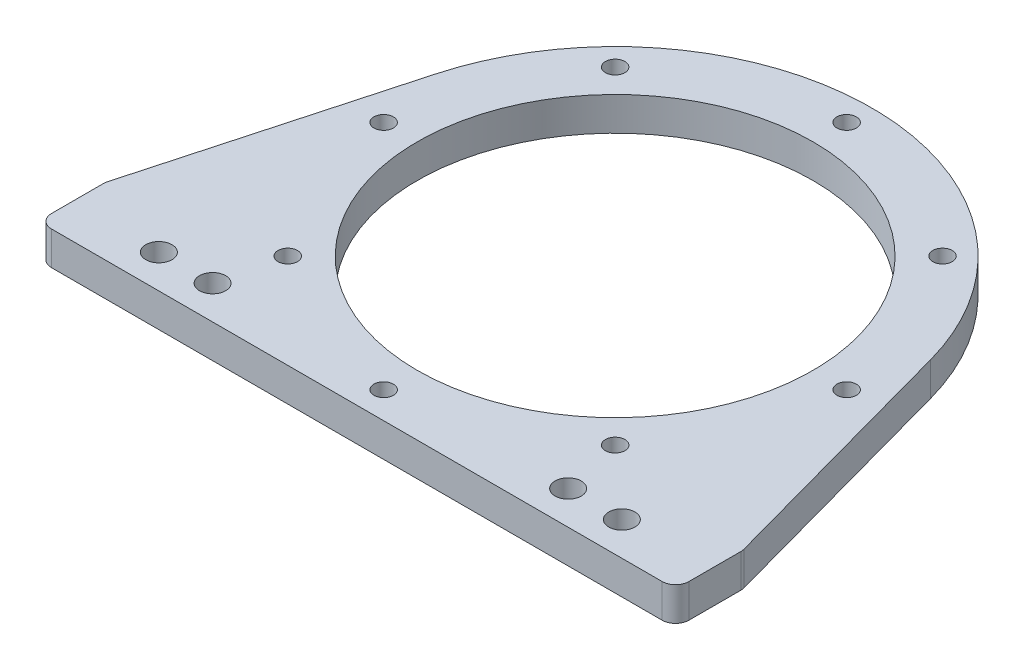
ISO-10303-21;
HEADER;
FILE_DESCRIPTION(('STEP AP214'),'2;1');
FILE_NAME('part.step','',(''),(''),'','','');
FILE_SCHEMA(('AUTOMOTIVE_DESIGN { 1 0 10303 214 1 1 1 1 }'));
ENDSEC;
DATA;
#1=APPLICATION_CONTEXT('core data for automotive mechanical design processes');
#2=APPLICATION_PROTOCOL_DEFINITION('international standard','automotive_design',2000,#1);
#3=PRODUCT_CONTEXT('',#1,'mechanical');
#4=PRODUCT('Part','Part','',(#3));
#5=PRODUCT_RELATED_PRODUCT_CATEGORY('part','',(#4));
#6=PRODUCT_DEFINITION_FORMATION('','',#4);
#7=PRODUCT_DEFINITION_CONTEXT('part definition',#1,'design');
#8=PRODUCT_DEFINITION('design','',#6,#7);
#9=PRODUCT_DEFINITION_SHAPE('','',#8);
#10=(LENGTH_UNIT() NAMED_UNIT(*) SI_UNIT(.MILLI.,.METRE.));
#11=(NAMED_UNIT(*) PLANE_ANGLE_UNIT() SI_UNIT($,.RADIAN.));
#12=(NAMED_UNIT(*) SI_UNIT($,.STERADIAN.) SOLID_ANGLE_UNIT());
#13=UNCERTAINTY_MEASURE_WITH_UNIT(LENGTH_MEASURE(1.E-05),#10,'distance_accuracy_value','');
#14=(GEOMETRIC_REPRESENTATION_CONTEXT(3) GLOBAL_UNCERTAINTY_ASSIGNED_CONTEXT((#13)) GLOBAL_UNIT_ASSIGNED_CONTEXT((#10,
#11,#12)) REPRESENTATION_CONTEXT('',''));
#15=CARTESIAN_POINT('',(0.,0.,0.));
#16=DIRECTION('',(0.,0.,1.));
#17=DIRECTION('',(1.,0.,0.));
#18=AXIS2_PLACEMENT_3D('',#15,#16,#17);
#19=CARTESIAN_POINT('',(0.,5.,0.));
#20=DIRECTION('',(0.,1.,0.));
#21=DIRECTION('',(0.,0.,1.));
#22=AXIS2_PLACEMENT_3D('',#19,#20,#21);
#23=PLANE('',#22);
#24=CARTESIAN_POINT('',(-34.5,5.,33.5));
#25=DIRECTION('',(0.,1.,0.));
#26=DIRECTION('',(0.,0.,1.));
#27=AXIS2_PLACEMENT_3D('',#24,#25,#26);
#28=CIRCLE('',#27,1.95);
#29=CARTESIAN_POINT('',(-34.5,5.,35.45));
#30=VERTEX_POINT('',#29);
#31=EDGE_CURVE('E290',#30,#30,#28,.T.);
#32=ORIENTED_EDGE('',*,*,#31,.F.);
#33=EDGE_LOOP('',(#32));
#34=FACE_BOUND('',#33,.T.);
#35=CARTESIAN_POINT('',(-26.5,5.,33.5));
#36=DIRECTION('',(0.,1.,0.));
#37=DIRECTION('',(0.,0.,1.));
#38=AXIS2_PLACEMENT_3D('',#35,#36,#37);
#39=CIRCLE('',#38,1.95);
#40=CARTESIAN_POINT('',(-26.5,5.,35.45));
#41=VERTEX_POINT('',#40);
#42=EDGE_CURVE('E287',#41,#41,#39,.T.);
#43=ORIENTED_EDGE('',*,*,#42,.F.);
#44=EDGE_LOOP('',(#43));
#45=FACE_BOUND('',#44,.T.);
#46=CARTESIAN_POINT('',(26.5,5.,33.5));
#47=DIRECTION('',(0.,1.,0.));
#48=DIRECTION('',(0.,0.,1.));
#49=AXIS2_PLACEMENT_3D('',#46,#47,#48);
#50=CIRCLE('',#49,1.95);
#51=CARTESIAN_POINT('',(26.5,5.,35.45));
#52=VERTEX_POINT('',#51);
#53=EDGE_CURVE('E281',#52,#52,#50,.T.);
#54=ORIENTED_EDGE('',*,*,#53,.F.);
#55=EDGE_LOOP('',(#54));
#56=FACE_BOUND('',#55,.T.);
#57=CARTESIAN_POINT('',(34.5,5.,33.5));
#58=DIRECTION('',(0.,1.,0.));
#59=DIRECTION('',(0.,0.,1.));
#60=AXIS2_PLACEMENT_3D('',#57,#58,#59);
#61=CIRCLE('',#60,1.95);
#62=CARTESIAN_POINT('',(34.5,5.,35.45));
#63=VERTEX_POINT('',#62);
#64=EDGE_CURVE('E275',#63,#63,#61,.T.);
#65=ORIENTED_EDGE('',*,*,#64,.F.);
#66=EDGE_LOOP('',(#65));
#67=FACE_BOUND('',#66,.T.);
#68=CARTESIAN_POINT('',(-3.61368318570264E-13,5.,34.5));
#69=DIRECTION('',(0.,1.,0.));
#70=DIRECTION('',(0.,0.,1.));
#71=AXIS2_PLACEMENT_3D('',#68,#69,#70);
#72=CIRCLE('',#71,1.45);
#73=CARTESIAN_POINT('',(-3.61368318570264E-13,5.,35.95));
#74=VERTEX_POINT('',#73);
#75=EDGE_CURVE('E257',#74,#74,#72,.T.);
#76=ORIENTED_EDGE('',*,*,#75,.F.);
#77=EDGE_LOOP('',(#76));
#78=FACE_BOUND('',#77,.T.);
#79=CARTESIAN_POINT('',(34.5,5.,2.40912212380176E-13));
#80=DIRECTION('',(0.,1.,0.));
#81=DIRECTION('',(0.,0.,1.));
#82=AXIS2_PLACEMENT_3D('',#79,#80,#81);
#83=CIRCLE('',#82,1.45);
#84=CARTESIAN_POINT('',(34.5,5.,1.45000000000024));
#85=VERTEX_POINT('',#84);
#86=EDGE_CURVE('E245',#85,#85,#83,.T.);
#87=ORIENTED_EDGE('',*,*,#86,.F.);
#88=EDGE_LOOP('',(#87));
#89=FACE_BOUND('',#88,.T.);
#90=CARTESIAN_POINT('',(1.20456106190088E-13,5.,-34.5));
#91=DIRECTION('',(0.,1.,0.));
#92=DIRECTION('',(0.,0.,1.));
#93=AXIS2_PLACEMENT_3D('',#90,#91,#92);
#94=CIRCLE('',#93,1.45);
#95=CARTESIAN_POINT('',(1.20456106190088E-13,5.,-33.05));
#96=VERTEX_POINT('',#95);
#97=EDGE_CURVE('E233',#96,#96,#94,.T.);
#98=ORIENTED_EDGE('',*,*,#97,.F.);
#99=EDGE_LOOP('',(#98));
#100=FACE_BOUND('',#99,.T.);
#101=CARTESIAN_POINT('',(-34.5,5.,0.));
#102=DIRECTION('',(0.,1.,0.));
#103=DIRECTION('',(0.,0.,1.));
#104=AXIS2_PLACEMENT_3D('',#101,#102,#103);
#105=CIRCLE('',#104,1.45);
#106=CARTESIAN_POINT('',(-34.5,5.,1.45));
#107=VERTEX_POINT('',#106);
#108=EDGE_CURVE('E222',#107,#107,#105,.T.);
#109=ORIENTED_EDGE('',*,*,#108,.F.);
#110=EDGE_LOOP('',(#109));
#111=FACE_BOUND('',#110,.T.);
#112=DIRECTION('',(0.,0.,-1.));
#113=VECTOR('',#112,1.);
#114=CARTESIAN_POINT('',(47.5,5.,38.5));
#115=LINE('',#114,#113);
#116=CARTESIAN_POINT('',(47.5,5.,36.5));
#117=VERTEX_POINT('',#116);
#118=CARTESIAN_POINT('',(47.5,5.,28.7698055067295));
#119=VERTEX_POINT('',#118);
#120=EDGE_CURVE('E218',#117,#119,#115,.T.);
#121=ORIENTED_EDGE('',*,*,#120,.T.);
#122=CARTESIAN_POINT('',(45.5,5.,28.7698055067295));
#123=DIRECTION('',(0.,1.,0.));
#124=DIRECTION('',(0.,0.,1.));
#125=AXIS2_PLACEMENT_3D('',#122,#123,#124);
#126=CIRCLE('',#125,2.);
#127=CARTESIAN_POINT('',(47.428506088564,5.,28.239839218772));
#128=VERTEX_POINT('',#127);
#129=EDGE_CURVE('E172',#119,#128,#126,.T.);
#130=ORIENTED_EDGE('',*,*,#129,.T.);
#131=DIRECTION('',(-0.264983143978784,0.,-0.964253044282007));
#132=VECTOR('',#131,1.);
#133=CARTESIAN_POINT('',(47.5,5.,28.5));
#134=LINE('',#133,#132);
#135=CARTESIAN_POINT('',(36.8826789437868,5.,-10.1356052571885));
#136=VERTEX_POINT('',#135);
#137=EDGE_CURVE('E137',#128,#136,#134,.T.);
#138=ORIENTED_EDGE('',*,*,#137,.T.);
#139=CARTESIAN_POINT('',(0.,5.,0.));
#140=DIRECTION('',(0.,1.,0.));
#141=DIRECTION('',(0.,0.,1.));
#142=AXIS2_PLACEMENT_3D('',#139,#140,#141);
#143=CIRCLE('',#142,38.25);
#144=CARTESIAN_POINT('',(-36.8826789437868,5.,-10.1356052571885));
#145=VERTEX_POINT('',#144);
#146=EDGE_CURVE('E131',#136,#145,#143,.T.);
#147=ORIENTED_EDGE('',*,*,#146,.T.);
#148=DIRECTION('',(-0.264983143978784,0.,0.964253044282007));
#149=VECTOR('',#148,1.);
#150=CARTESIAN_POINT('',(-36.8826789437868,5.,-10.1356052571885));
#151=LINE('',#150,#149);
#152=CARTESIAN_POINT('',(-47.428506088564,5.,28.239839218772));
#153=VERTEX_POINT('',#152);
#154=EDGE_CURVE('E121',#145,#153,#151,.T.);
#155=ORIENTED_EDGE('',*,*,#154,.T.);
#156=CARTESIAN_POINT('',(-45.5,5.,28.7698055067296));
#157=DIRECTION('',(0.,1.,0.));
#158=DIRECTION('',(0.,0.,1.));
#159=AXIS2_PLACEMENT_3D('',#156,#157,#158);
#160=CIRCLE('',#159,2.);
#161=CARTESIAN_POINT('',(-47.5,5.,28.7698055067296));
#162=VERTEX_POINT('',#161);
#163=EDGE_CURVE('E167',#153,#162,#160,.T.);
#164=ORIENTED_EDGE('',*,*,#163,.T.);
#165=DIRECTION('',(0.,0.,1.));
#166=VECTOR('',#165,1.);
#167=CARTESIAN_POINT('',(-47.5,5.,28.5));
#168=LINE('',#167,#166);
#169=CARTESIAN_POINT('',(-47.5,5.,36.5));
#170=VERTEX_POINT('',#169);
#171=EDGE_CURVE('E130',#162,#170,#168,.T.);
#172=ORIENTED_EDGE('',*,*,#171,.T.);
#173=CARTESIAN_POINT('',(-45.5,5.,36.5));
#174=DIRECTION('',(0.,1.,0.));
#175=DIRECTION('',(0.,0.,1.));
#176=AXIS2_PLACEMENT_3D('',#173,#174,#175);
#177=CIRCLE('',#176,2.);
#178=CARTESIAN_POINT('',(-45.5,5.,38.5));
#179=VERTEX_POINT('',#178);
#180=EDGE_CURVE('E65',#170,#179,#177,.T.);
#181=ORIENTED_EDGE('',*,*,#180,.T.);
#182=DIRECTION('',(1.,0.,0.));
#183=VECTOR('',#182,1.);
#184=CARTESIAN_POINT('',(-47.5,5.,38.5));
#185=LINE('',#184,#183);
#186=CARTESIAN_POINT('',(45.5,5.,38.5));
#187=VERTEX_POINT('',#186);
#188=EDGE_CURVE('E189',#179,#187,#185,.T.);
#189=ORIENTED_EDGE('',*,*,#188,.T.);
#190=CARTESIAN_POINT('',(45.5,5.,36.5));
#191=DIRECTION('',(0.,1.,0.));
#192=DIRECTION('',(0.,0.,1.));
#193=AXIS2_PLACEMENT_3D('',#190,#191,#192);
#194=CIRCLE('',#193,2.);
#195=EDGE_CURVE('E170',#187,#117,#194,.T.);
#196=ORIENTED_EDGE('',*,*,#195,.T.);
#197=EDGE_LOOP('',(#121,#130,#138,#147,#155,#164,#172,#181,#189,#196));
#198=FACE_BOUND('',#197,.T.);
#199=CARTESIAN_POINT('',(0.,5.,0.));
#200=DIRECTION('',(0.,1.,0.));
#201=DIRECTION('',(0.,0.,1.));
#202=AXIS2_PLACEMENT_3D('',#199,#200,#201);
#203=CIRCLE('',#202,29.5);
#204=CARTESIAN_POINT('',(0.,5.,29.5));
#205=VERTEX_POINT('',#204);
#206=EDGE_CURVE('E211',#205,#205,#203,.T.);
#207=ORIENTED_EDGE('',*,*,#206,.F.);
#208=EDGE_LOOP('',(#207));
#209=FACE_BOUND('',#208,.T.);
#210=CARTESIAN_POINT('',(-24.3951839509358,5.,-24.3951839509359));
#211=DIRECTION('',(0.,1.,0.));
#212=DIRECTION('',(0.,0.,1.));
#213=AXIS2_PLACEMENT_3D('',#210,#211,#212);
#214=CIRCLE('',#213,1.45);
#215=CARTESIAN_POINT('',(-24.3951839509358,5.,-22.9451839509359));
#216=VERTEX_POINT('',#215);
#217=EDGE_CURVE('E227',#216,#216,#214,.T.);
#218=ORIENTED_EDGE('',*,*,#217,.F.);
#219=EDGE_LOOP('',(#218));
#220=FACE_BOUND('',#219,.T.);
#221=CARTESIAN_POINT('',(24.395183950936,5.,-24.3951839509358));
#222=DIRECTION('',(0.,1.,0.));
#223=DIRECTION('',(0.,0.,1.));
#224=AXIS2_PLACEMENT_3D('',#221,#222,#223);
#225=CIRCLE('',#224,1.45);
#226=CARTESIAN_POINT('',(24.395183950936,5.,-22.9451839509358));
#227=VERTEX_POINT('',#226);
#228=EDGE_CURVE('E239',#227,#227,#225,.T.);
#229=ORIENTED_EDGE('',*,*,#228,.F.);
#230=EDGE_LOOP('',(#229));
#231=FACE_BOUND('',#230,.T.);
#232=CARTESIAN_POINT('',(24.3951839509357,5.,24.3951839509361));
#233=DIRECTION('',(0.,1.,0.));
#234=DIRECTION('',(0.,0.,1.));
#235=AXIS2_PLACEMENT_3D('',#232,#233,#234);
#236=CIRCLE('',#235,1.45);
#237=CARTESIAN_POINT('',(24.3951839509357,5.,25.8451839509361));
#238=VERTEX_POINT('',#237);
#239=EDGE_CURVE('E251',#238,#238,#236,.T.);
#240=ORIENTED_EDGE('',*,*,#239,.F.);
#241=EDGE_LOOP('',(#240));
#242=FACE_BOUND('',#241,.T.);
#243=CARTESIAN_POINT('',(-24.3951839509362,5.,24.3951839509356));
#244=DIRECTION('',(0.,1.,0.));
#245=DIRECTION('',(0.,0.,1.));
#246=AXIS2_PLACEMENT_3D('',#243,#244,#245);
#247=CIRCLE('',#246,1.45);
#248=CARTESIAN_POINT('',(-24.3951839509362,5.,25.8451839509356));
#249=VERTEX_POINT('',#248);
#250=EDGE_CURVE('E263',#249,#249,#247,.T.);
#251=ORIENTED_EDGE('',*,*,#250,.F.);
#252=EDGE_LOOP('',(#251));
#253=FACE_BOUND('',#252,.T.);
#254=ADVANCED_FACE('F43',(#34,#45,#56,#67,#78,#89,#100,#111,#198,#209,#220,#231,#242,#253),#23,.T.);
#255=CARTESIAN_POINT('',(0.,0.,0.));
#256=DIRECTION('',(0.,1.,0.));
#257=DIRECTION('',(0.,0.,1.));
#258=AXIS2_PLACEMENT_3D('',#255,#256,#257);
#259=PLANE('',#258);
#260=CARTESIAN_POINT('',(-34.5,0.,33.5));
#261=DIRECTION('',(0.,1.,0.));
#262=DIRECTION('',(0.,0.,1.));
#263=AXIS2_PLACEMENT_3D('',#260,#261,#262);
#264=CIRCLE('',#263,1.95);
#265=CARTESIAN_POINT('',(-34.5,0.,35.45));
#266=VERTEX_POINT('',#265);
#267=EDGE_CURVE('E269',#266,#266,#264,.T.);
#268=ORIENTED_EDGE('',*,*,#267,.T.);
#269=EDGE_LOOP('',(#268));
#270=FACE_BOUND('',#269,.T.);
#271=CARTESIAN_POINT('',(-26.5,0.,33.5));
#272=DIRECTION('',(0.,1.,0.));
#273=DIRECTION('',(0.,0.,1.));
#274=AXIS2_PLACEMENT_3D('',#271,#272,#273);
#275=CIRCLE('',#274,1.95);
#276=CARTESIAN_POINT('',(-26.5,0.,35.45));
#277=VERTEX_POINT('',#276);
#278=EDGE_CURVE('E284',#277,#277,#275,.T.);
#279=ORIENTED_EDGE('',*,*,#278,.T.);
#280=EDGE_LOOP('',(#279));
#281=FACE_BOUND('',#280,.T.);
#282=CARTESIAN_POINT('',(26.5,0.,33.5));
#283=DIRECTION('',(0.,1.,0.));
#284=DIRECTION('',(0.,0.,1.));
#285=AXIS2_PLACEMENT_3D('',#282,#283,#284);
#286=CIRCLE('',#285,1.95);
#287=CARTESIAN_POINT('',(26.5,0.,35.45));
#288=VERTEX_POINT('',#287);
#289=EDGE_CURVE('E278',#288,#288,#286,.T.);
#290=ORIENTED_EDGE('',*,*,#289,.T.);
#291=EDGE_LOOP('',(#290));
#292=FACE_BOUND('',#291,.T.);
#293=CARTESIAN_POINT('',(34.5,0.,33.5));
#294=DIRECTION('',(0.,1.,0.));
#295=DIRECTION('',(0.,0.,1.));
#296=AXIS2_PLACEMENT_3D('',#293,#294,#295);
#297=CIRCLE('',#296,1.95);
#298=CARTESIAN_POINT('',(34.5,0.,35.45));
#299=VERTEX_POINT('',#298);
#300=EDGE_CURVE('E272',#299,#299,#297,.T.);
#301=ORIENTED_EDGE('',*,*,#300,.T.);
#302=EDGE_LOOP('',(#301));
#303=FACE_BOUND('',#302,.T.);
#304=DIRECTION('',(-0.264983143978784,0.,-0.964253044282007));
#305=VECTOR('',#304,1.);
#306=CARTESIAN_POINT('',(47.5,0.,28.5));
#307=LINE('',#306,#305);
#308=CARTESIAN_POINT('',(47.428506088564,0.,28.239839218772));
#309=VERTEX_POINT('',#308);
#310=CARTESIAN_POINT('',(36.8826789437868,0.,-10.1356052571885));
#311=VERTEX_POINT('',#310);
#312=EDGE_CURVE('E141',#309,#311,#307,.T.);
#313=ORIENTED_EDGE('',*,*,#312,.F.);
#314=CARTESIAN_POINT('',(45.5,0.,28.7698055067295));
#315=DIRECTION('',(0.,1.,0.));
#316=DIRECTION('',(0.,0.,1.));
#317=AXIS2_PLACEMENT_3D('',#314,#315,#316);
#318=CIRCLE('',#317,2.);
#319=CARTESIAN_POINT('',(47.5,0.,28.7698055067295));
#320=VERTEX_POINT('',#319);
#321=EDGE_CURVE('E160',#309,#320,#318,.F.);
#322=ORIENTED_EDGE('',*,*,#321,.T.);
#323=DIRECTION('',(0.,0.,-1.));
#324=VECTOR('',#323,1.);
#325=CARTESIAN_POINT('',(47.5,0.,38.5));
#326=LINE('',#325,#324);
#327=CARTESIAN_POINT('',(47.5,0.,36.5));
#328=VERTEX_POINT('',#327);
#329=EDGE_CURVE('E201',#328,#320,#326,.T.);
#330=ORIENTED_EDGE('',*,*,#329,.F.);
#331=CARTESIAN_POINT('',(45.5,0.,36.5));
#332=DIRECTION('',(0.,1.,0.));
#333=DIRECTION('',(0.,0.,1.));
#334=AXIS2_PLACEMENT_3D('',#331,#332,#333);
#335=CIRCLE('',#334,2.);
#336=CARTESIAN_POINT('',(45.5,0.,38.5));
#337=VERTEX_POINT('',#336);
#338=EDGE_CURVE('E158',#328,#337,#335,.F.);
#339=ORIENTED_EDGE('',*,*,#338,.T.);
#340=DIRECTION('',(1.,0.,0.));
#341=VECTOR('',#340,1.);
#342=CARTESIAN_POINT('',(-47.5,0.,38.5));
#343=LINE('',#342,#341);
#344=CARTESIAN_POINT('',(-45.5,0.,38.5));
#345=VERTEX_POINT('',#344);
#346=EDGE_CURVE('E195',#345,#337,#343,.T.);
#347=ORIENTED_EDGE('',*,*,#346,.F.);
#348=CARTESIAN_POINT('',(-45.5,0.,36.5));
#349=DIRECTION('',(0.,1.,0.));
#350=DIRECTION('',(0.,0.,1.));
#351=AXIS2_PLACEMENT_3D('',#348,#349,#350);
#352=CIRCLE('',#351,2.);
#353=CARTESIAN_POINT('',(-47.5,0.,36.5));
#354=VERTEX_POINT('',#353);
#355=EDGE_CURVE('E156',#345,#354,#352,.F.);
#356=ORIENTED_EDGE('',*,*,#355,.T.);
#357=DIRECTION('',(0.,0.,1.));
#358=VECTOR('',#357,1.);
#359=CARTESIAN_POINT('',(-47.5,0.,28.5));
#360=LINE('',#359,#358);
#361=CARTESIAN_POINT('',(-47.5,0.,28.7698055067296));
#362=VERTEX_POINT('',#361);
#363=EDGE_CURVE('E187',#362,#354,#360,.T.);
#364=ORIENTED_EDGE('',*,*,#363,.F.);
#365=CARTESIAN_POINT('',(-45.5,0.,28.7698055067296));
#366=DIRECTION('',(0.,1.,0.));
#367=DIRECTION('',(0.,0.,1.));
#368=AXIS2_PLACEMENT_3D('',#365,#366,#367);
#369=CIRCLE('',#368,2.);
#370=CARTESIAN_POINT('',(-47.428506088564,0.,28.239839218772));
#371=VERTEX_POINT('',#370);
#372=EDGE_CURVE('E150',#362,#371,#369,.F.);
#373=ORIENTED_EDGE('',*,*,#372,.T.);
#374=DIRECTION('',(-0.264983143978784,0.,0.964253044282007));
#375=VECTOR('',#374,1.);
#376=CARTESIAN_POINT('',(-36.8826789437868,0.,-10.1356052571885));
#377=LINE('',#376,#375);
#378=CARTESIAN_POINT('',(-36.8826789437868,0.,-10.1356052571885));
#379=VERTEX_POINT('',#378);
#380=EDGE_CURVE('E205',#379,#371,#377,.T.);
#381=ORIENTED_EDGE('',*,*,#380,.F.);
#382=CARTESIAN_POINT('',(0.,0.,0.));
#383=DIRECTION('',(0.,1.,0.));
#384=DIRECTION('',(0.,0.,1.));
#385=AXIS2_PLACEMENT_3D('',#382,#383,#384);
#386=CIRCLE('',#385,38.25);
#387=EDGE_CURVE('E145',#311,#379,#386,.T.);
#388=ORIENTED_EDGE('',*,*,#387,.F.);
#389=EDGE_LOOP('',(#313,#322,#330,#339,#347,#356,#364,#373,#381,#388));
#390=FACE_BOUND('',#389,.T.);
#391=CARTESIAN_POINT('',(0.,0.,0.));
#392=DIRECTION('',(0.,1.,0.));
#393=DIRECTION('',(0.,0.,1.));
#394=AXIS2_PLACEMENT_3D('',#391,#392,#393);
#395=CIRCLE('',#394,29.5);
#396=CARTESIAN_POINT('',(0.,0.,29.5));
#397=VERTEX_POINT('',#396);
#398=EDGE_CURVE('E214',#397,#397,#395,.T.);
#399=ORIENTED_EDGE('',*,*,#398,.T.);
#400=EDGE_LOOP('',(#399));
#401=FACE_BOUND('',#400,.T.);
#402=CARTESIAN_POINT('',(-34.5,0.,0.));
#403=DIRECTION('',(0.,1.,0.));
#404=DIRECTION('',(0.,0.,1.));
#405=AXIS2_PLACEMENT_3D('',#402,#403,#404);
#406=CIRCLE('',#405,1.45);
#407=CARTESIAN_POINT('',(-34.5,0.,1.45));
#408=VERTEX_POINT('',#407);
#409=EDGE_CURVE('E224',#408,#408,#406,.T.);
#410=ORIENTED_EDGE('',*,*,#409,.T.);
#411=EDGE_LOOP('',(#410));
#412=FACE_BOUND('',#411,.T.);
#413=CARTESIAN_POINT('',(-24.3951839509358,0.,-24.3951839509359));
#414=DIRECTION('',(0.,1.,0.));
#415=DIRECTION('',(0.,0.,1.));
#416=AXIS2_PLACEMENT_3D('',#413,#414,#415);
#417=CIRCLE('',#416,1.45);
#418=CARTESIAN_POINT('',(-24.3951839509358,0.,-22.9451839509359));
#419=VERTEX_POINT('',#418);
#420=EDGE_CURVE('E230',#419,#419,#417,.T.);
#421=ORIENTED_EDGE('',*,*,#420,.T.);
#422=EDGE_LOOP('',(#421));
#423=FACE_BOUND('',#422,.T.);
#424=CARTESIAN_POINT('',(1.20456106190088E-13,0.,-34.5));
#425=DIRECTION('',(0.,1.,0.));
#426=DIRECTION('',(0.,0.,1.));
#427=AXIS2_PLACEMENT_3D('',#424,#425,#426);
#428=CIRCLE('',#427,1.45);
#429=CARTESIAN_POINT('',(1.20456106190088E-13,0.,-33.05));
#430=VERTEX_POINT('',#429);
#431=EDGE_CURVE('E236',#430,#430,#428,.T.);
#432=ORIENTED_EDGE('',*,*,#431,.T.);
#433=EDGE_LOOP('',(#432));
#434=FACE_BOUND('',#433,.T.);
#435=CARTESIAN_POINT('',(24.395183950936,0.,-24.3951839509358));
#436=DIRECTION('',(0.,1.,0.));
#437=DIRECTION('',(0.,0.,1.));
#438=AXIS2_PLACEMENT_3D('',#435,#436,#437);
#439=CIRCLE('',#438,1.45);
#440=CARTESIAN_POINT('',(24.395183950936,0.,-22.9451839509358));
#441=VERTEX_POINT('',#440);
#442=EDGE_CURVE('E242',#441,#441,#439,.T.);
#443=ORIENTED_EDGE('',*,*,#442,.T.);
#444=EDGE_LOOP('',(#443));
#445=FACE_BOUND('',#444,.T.);
#446=CARTESIAN_POINT('',(34.5,0.,2.40912212380176E-13));
#447=DIRECTION('',(0.,1.,0.));
#448=DIRECTION('',(0.,0.,1.));
#449=AXIS2_PLACEMENT_3D('',#446,#447,#448);
#450=CIRCLE('',#449,1.45);
#451=CARTESIAN_POINT('',(34.5,0.,1.45000000000024));
#452=VERTEX_POINT('',#451);
#453=EDGE_CURVE('E248',#452,#452,#450,.T.);
#454=ORIENTED_EDGE('',*,*,#453,.T.);
#455=EDGE_LOOP('',(#454));
#456=FACE_BOUND('',#455,.T.);
#457=CARTESIAN_POINT('',(24.3951839509357,0.,24.3951839509361));
#458=DIRECTION('',(0.,1.,0.));
#459=DIRECTION('',(0.,0.,1.));
#460=AXIS2_PLACEMENT_3D('',#457,#458,#459);
#461=CIRCLE('',#460,1.45);
#462=CARTESIAN_POINT('',(24.3951839509357,0.,25.8451839509361));
#463=VERTEX_POINT('',#462);
#464=EDGE_CURVE('E254',#463,#463,#461,.T.);
#465=ORIENTED_EDGE('',*,*,#464,.T.);
#466=EDGE_LOOP('',(#465));
#467=FACE_BOUND('',#466,.T.);
#468=CARTESIAN_POINT('',(-3.61368318570264E-13,0.,34.5));
#469=DIRECTION('',(0.,1.,0.));
#470=DIRECTION('',(0.,0.,1.));
#471=AXIS2_PLACEMENT_3D('',#468,#469,#470);
#472=CIRCLE('',#471,1.45);
#473=CARTESIAN_POINT('',(-3.61368318570264E-13,0.,35.95));
#474=VERTEX_POINT('',#473);
#475=EDGE_CURVE('E260',#474,#474,#472,.T.);
#476=ORIENTED_EDGE('',*,*,#475,.T.);
#477=EDGE_LOOP('',(#476));
#478=FACE_BOUND('',#477,.T.);
#479=CARTESIAN_POINT('',(-24.3951839509362,0.,24.3951839509356));
#480=DIRECTION('',(0.,1.,0.));
#481=DIRECTION('',(0.,0.,1.));
#482=AXIS2_PLACEMENT_3D('',#479,#480,#481);
#483=CIRCLE('',#482,1.45);
#484=CARTESIAN_POINT('',(-24.3951839509362,0.,25.8451839509356));
#485=VERTEX_POINT('',#484);
#486=EDGE_CURVE('E266',#485,#485,#483,.T.);
#487=ORIENTED_EDGE('',*,*,#486,.T.);
#488=EDGE_LOOP('',(#487));
#489=FACE_BOUND('',#488,.T.);
#490=ADVANCED_FACE('F198',(#270,#281,#292,#303,#390,#401,#412,#423,#434,#445,#456,#467,#478,
#489),#259,.F.);
#491=CARTESIAN_POINT('',(0.,5.,0.));
#492=DIRECTION('',(0.,-1.,0.));
#493=DIRECTION('',(0.,0.,-1.));
#494=AXIS2_PLACEMENT_3D('',#491,#492,#493);
#495=CYLINDRICAL_SURFACE('',#494,38.25);
#496=ORIENTED_EDGE('',*,*,#387,.T.);
#497=DIRECTION('',(0.,-1.,0.));
#498=VECTOR('',#497,1.);
#499=CARTESIAN_POINT('',(-36.8826789437868,5.,-10.1356052571885));
#500=LINE('',#499,#498);
#501=EDGE_CURVE('E126',#145,#379,#500,.T.);
#502=ORIENTED_EDGE('',*,*,#501,.F.);
#503=ORIENTED_EDGE('',*,*,#146,.F.);
#504=DIRECTION('',(0.,-1.,0.));
#505=VECTOR('',#504,1.);
#506=CARTESIAN_POINT('',(36.8826789437868,5.,-10.1356052571885));
#507=LINE('',#506,#505);
#508=EDGE_CURVE('E147',#136,#311,#507,.T.);
#509=ORIENTED_EDGE('',*,*,#508,.T.);
#510=EDGE_LOOP('',(#496,#502,#503,#509));
#511=FACE_BOUND('',#510,.T.);
#512=ADVANCED_FACE('F143',(#511),#495,.T.);
#513=CARTESIAN_POINT('',(-36.8826789437868,5.,-10.1356052571885));
#514=DIRECTION('',(0.964253044282007,0.,0.264983143978784));
#515=DIRECTION('',(0.264983143978784,0.,-0.964253044282007));
#516=AXIS2_PLACEMENT_3D('',#513,#514,#515);
#517=PLANE('',#516);
#518=ORIENTED_EDGE('',*,*,#380,.T.);
#519=DIRECTION('',(0.,-1.,0.));
#520=VECTOR('',#519,1.);
#521=CARTESIAN_POINT('',(-47.428506088564,5.,28.239839218772));
#522=LINE('',#521,#520);
#523=EDGE_CURVE('E11',#371,#153,#522,.F.);
#524=ORIENTED_EDGE('',*,*,#523,.T.);
#525=ORIENTED_EDGE('',*,*,#154,.F.);
#526=ORIENTED_EDGE('',*,*,#501,.T.);
#527=EDGE_LOOP('',(#518,#524,#525,#526));
#528=FACE_BOUND('',#527,.T.);
#529=ADVANCED_FACE('F124',(#528),#517,.F.);
#530=CARTESIAN_POINT('',(-47.5,5.,28.5));
#531=DIRECTION('',(1.,0.,0.));
#532=DIRECTION('',(0.,0.,-1.));
#533=AXIS2_PLACEMENT_3D('',#530,#531,#532);
#534=PLANE('',#533);
#535=ORIENTED_EDGE('',*,*,#363,.T.);
#536=DIRECTION('',(0.,-1.,0.));
#537=VECTOR('',#536,1.);
#538=CARTESIAN_POINT('',(-47.5,5.,36.5));
#539=LINE('',#538,#537);
#540=EDGE_CURVE('E51',#354,#170,#539,.F.);
#541=ORIENTED_EDGE('',*,*,#540,.T.);
#542=ORIENTED_EDGE('',*,*,#171,.F.);
#543=DIRECTION('',(0.,-1.,0.));
#544=VECTOR('',#543,1.);
#545=CARTESIAN_POINT('',(-47.5,5.,28.7698055067296));
#546=LINE('',#545,#544);
#547=EDGE_CURVE('E178',#162,#362,#546,.T.);
#548=ORIENTED_EDGE('',*,*,#547,.T.);
#549=EDGE_LOOP('',(#535,#541,#542,#548));
#550=FACE_BOUND('',#549,.T.);
#551=ADVANCED_FACE('F184',(#550),#534,.F.);
#552=CARTESIAN_POINT('',(-47.5,5.,38.5));
#553=DIRECTION('',(0.,0.,-1.));
#554=DIRECTION('',(-1.,0.,0.));
#555=AXIS2_PLACEMENT_3D('',#552,#553,#554);
#556=PLANE('',#555);
#557=ORIENTED_EDGE('',*,*,#346,.T.);
#558=DIRECTION('',(0.,-1.,0.));
#559=VECTOR('',#558,1.);
#560=CARTESIAN_POINT('',(45.5,5.,38.5));
#561=LINE('',#560,#559);
#562=EDGE_CURVE('E58',#337,#187,#561,.F.);
#563=ORIENTED_EDGE('',*,*,#562,.T.);
#564=ORIENTED_EDGE('',*,*,#188,.F.);
#565=DIRECTION('',(0.,-1.,0.));
#566=VECTOR('',#565,1.);
#567=CARTESIAN_POINT('',(-45.5,5.,38.5));
#568=LINE('',#567,#566);
#569=EDGE_CURVE('E174',#179,#345,#568,.T.);
#570=ORIENTED_EDGE('',*,*,#569,.T.);
#571=EDGE_LOOP('',(#557,#563,#564,#570));
#572=FACE_BOUND('',#571,.T.);
#573=ADVANCED_FACE('F194',(#572),#556,.F.);
#574=CARTESIAN_POINT('',(47.5,5.,38.5));
#575=DIRECTION('',(-1.,0.,0.));
#576=DIRECTION('',(0.,0.,1.));
#577=AXIS2_PLACEMENT_3D('',#574,#575,#576);
#578=PLANE('',#577);
#579=ORIENTED_EDGE('',*,*,#329,.T.);
#580=DIRECTION('',(0.,-1.,0.));
#581=VECTOR('',#580,1.);
#582=CARTESIAN_POINT('',(47.5,5.,28.7698055067295));
#583=LINE('',#582,#581);
#584=EDGE_CURVE('E165',#320,#119,#583,.F.);
#585=ORIENTED_EDGE('',*,*,#584,.T.);
#586=ORIENTED_EDGE('',*,*,#120,.F.);
#587=DIRECTION('',(0.,-1.,0.));
#588=VECTOR('',#587,1.);
#589=CARTESIAN_POINT('',(47.5,5.,36.5));
#590=LINE('',#589,#588);
#591=EDGE_CURVE('E162',#117,#328,#590,.T.);
#592=ORIENTED_EDGE('',*,*,#591,.T.);
#593=EDGE_LOOP('',(#579,#585,#586,#592));
#594=FACE_BOUND('',#593,.T.);
#595=ADVANCED_FACE('F389',(#594),#578,.F.);
#596=CARTESIAN_POINT('',(47.5,5.,28.5));
#597=DIRECTION('',(-0.964253044282007,0.,0.264983143978784));
#598=DIRECTION('',(0.264983143978784,0.,0.964253044282007));
#599=AXIS2_PLACEMENT_3D('',#596,#597,#598);
#600=PLANE('',#599);
#601=ORIENTED_EDGE('',*,*,#137,.F.);
#602=DIRECTION('',(0.,-1.,0.));
#603=VECTOR('',#602,1.);
#604=CARTESIAN_POINT('',(47.428506088564,5.,28.239839218772));
#605=LINE('',#604,#603);
#606=EDGE_CURVE('E146',#128,#309,#605,.T.);
#607=ORIENTED_EDGE('',*,*,#606,.T.);
#608=ORIENTED_EDGE('',*,*,#312,.T.);
#609=ORIENTED_EDGE('',*,*,#508,.F.);
#610=EDGE_LOOP('',(#601,#607,#608,#609));
#611=FACE_BOUND('',#610,.T.);
#612=ADVANCED_FACE('F209',(#611),#600,.F.);
#613=CARTESIAN_POINT('',(0.,5.,0.));
#614=DIRECTION('',(0.,-1.,0.));
#615=DIRECTION('',(0.,0.,-1.));
#616=AXIS2_PLACEMENT_3D('',#613,#614,#615);
#617=CYLINDRICAL_SURFACE('',#616,29.5);
#618=ORIENTED_EDGE('',*,*,#206,.T.);
#619=EDGE_LOOP('',(#618));
#620=FACE_BOUND('',#619,.T.);
#621=ORIENTED_EDGE('',*,*,#398,.F.);
#622=EDGE_LOOP('',(#621));
#623=FACE_BOUND('',#622,.T.);
#624=ADVANCED_FACE('F327',(#620,#623),#617,.F.);
#625=CARTESIAN_POINT('',(-34.5,5.,0.));
#626=DIRECTION('',(0.,-1.,0.));
#627=DIRECTION('',(0.,0.,-1.));
#628=AXIS2_PLACEMENT_3D('',#625,#626,#627);
#629=CYLINDRICAL_SURFACE('',#628,1.45);
#630=ORIENTED_EDGE('',*,*,#108,.T.);
#631=EDGE_LOOP('',(#630));
#632=FACE_BOUND('',#631,.T.);
#633=ORIENTED_EDGE('',*,*,#409,.F.);
#634=EDGE_LOOP('',(#633));
#635=FACE_BOUND('',#634,.T.);
#636=ADVANCED_FACE('F323',(#632,#635),#629,.F.);
#637=CARTESIAN_POINT('',(-24.3951839509358,5.,-24.3951839509359));
#638=DIRECTION('',(0.,-1.,0.));
#639=DIRECTION('',(0.,0.,-1.));
#640=AXIS2_PLACEMENT_3D('',#637,#638,#639);
#641=CYLINDRICAL_SURFACE('',#640,1.45);
#642=ORIENTED_EDGE('',*,*,#217,.T.);
#643=EDGE_LOOP('',(#642));
#644=FACE_BOUND('',#643,.T.);
#645=ORIENTED_EDGE('',*,*,#420,.F.);
#646=EDGE_LOOP('',(#645));
#647=FACE_BOUND('',#646,.T.);
#648=ADVANCED_FACE('F326',(#644,#647),#641,.F.);
#649=CARTESIAN_POINT('',(1.20456106190088E-13,5.,-34.5));
#650=DIRECTION('',(0.,-1.,0.));
#651=DIRECTION('',(0.,0.,-1.));
#652=AXIS2_PLACEMENT_3D('',#649,#650,#651);
#653=CYLINDRICAL_SURFACE('',#652,1.45);
#654=ORIENTED_EDGE('',*,*,#97,.T.);
#655=EDGE_LOOP('',(#654));
#656=FACE_BOUND('',#655,.T.);
#657=ORIENTED_EDGE('',*,*,#431,.F.);
#658=EDGE_LOOP('',(#657));
#659=FACE_BOUND('',#658,.T.);
#660=ADVANCED_FACE('F376',(#656,#659),#653,.F.);
#661=CARTESIAN_POINT('',(24.395183950936,5.,-24.3951839509358));
#662=DIRECTION('',(0.,-1.,0.));
#663=DIRECTION('',(0.,0.,-1.));
#664=AXIS2_PLACEMENT_3D('',#661,#662,#663);
#665=CYLINDRICAL_SURFACE('',#664,1.45);
#666=ORIENTED_EDGE('',*,*,#228,.T.);
#667=EDGE_LOOP('',(#666));
#668=FACE_BOUND('',#667,.T.);
#669=ORIENTED_EDGE('',*,*,#442,.F.);
#670=EDGE_LOOP('',(#669));
#671=FACE_BOUND('',#670,.T.);
#672=ADVANCED_FACE('F372',(#668,#671),#665,.F.);
#673=CARTESIAN_POINT('',(34.5,5.,2.40912212380176E-13));
#674=DIRECTION('',(0.,-1.,0.));
#675=DIRECTION('',(0.,0.,-1.));
#676=AXIS2_PLACEMENT_3D('',#673,#674,#675);
#677=CYLINDRICAL_SURFACE('',#676,1.45);
#678=ORIENTED_EDGE('',*,*,#86,.T.);
#679=EDGE_LOOP('',(#678));
#680=FACE_BOUND('',#679,.T.);
#681=ORIENTED_EDGE('',*,*,#453,.F.);
#682=EDGE_LOOP('',(#681));
#683=FACE_BOUND('',#682,.T.);
#684=ADVANCED_FACE('F368',(#680,#683),#677,.F.);
#685=CARTESIAN_POINT('',(24.3951839509357,5.,24.3951839509361));
#686=DIRECTION('',(0.,-1.,0.));
#687=DIRECTION('',(0.,0.,-1.));
#688=AXIS2_PLACEMENT_3D('',#685,#686,#687);
#689=CYLINDRICAL_SURFACE('',#688,1.45);
#690=ORIENTED_EDGE('',*,*,#239,.T.);
#691=EDGE_LOOP('',(#690));
#692=FACE_BOUND('',#691,.T.);
#693=ORIENTED_EDGE('',*,*,#464,.F.);
#694=EDGE_LOOP('',(#693));
#695=FACE_BOUND('',#694,.T.);
#696=ADVANCED_FACE('F361',(#692,#695),#689,.F.);
#697=CARTESIAN_POINT('',(-3.61368318570264E-13,5.,34.5));
#698=DIRECTION('',(0.,-1.,0.));
#699=DIRECTION('',(0.,0.,-1.));
#700=AXIS2_PLACEMENT_3D('',#697,#698,#699);
#701=CYLINDRICAL_SURFACE('',#700,1.45);
#702=ORIENTED_EDGE('',*,*,#75,.T.);
#703=EDGE_LOOP('',(#702));
#704=FACE_BOUND('',#703,.T.);
#705=ORIENTED_EDGE('',*,*,#475,.F.);
#706=EDGE_LOOP('',(#705));
#707=FACE_BOUND('',#706,.T.);
#708=ADVANCED_FACE('F351',(#704,#707),#701,.F.);
#709=CARTESIAN_POINT('',(-24.3951839509362,5.,24.3951839509356));
#710=DIRECTION('',(0.,-1.,0.));
#711=DIRECTION('',(0.,0.,-1.));
#712=AXIS2_PLACEMENT_3D('',#709,#710,#711);
#713=CYLINDRICAL_SURFACE('',#712,1.45);
#714=ORIENTED_EDGE('',*,*,#250,.T.);
#715=EDGE_LOOP('',(#714));
#716=FACE_BOUND('',#715,.T.);
#717=ORIENTED_EDGE('',*,*,#486,.F.);
#718=EDGE_LOOP('',(#717));
#719=FACE_BOUND('',#718,.T.);
#720=ADVANCED_FACE('F348',(#716,#719),#713,.F.);
#721=CARTESIAN_POINT('',(34.5,0.,33.5));
#722=DIRECTION('',(0.,1.,0.));
#723=DIRECTION('',(0.,0.,1.));
#724=AXIS2_PLACEMENT_3D('',#721,#722,#723);
#725=CYLINDRICAL_SURFACE('',#724,1.95);
#726=ORIENTED_EDGE('',*,*,#300,.F.);
#727=EDGE_LOOP('',(#726));
#728=FACE_BOUND('',#727,.T.);
#729=ORIENTED_EDGE('',*,*,#64,.T.);
#730=EDGE_LOOP('',(#729));
#731=FACE_BOUND('',#730,.T.);
#732=ADVANCED_FACE('F350',(#728,#731),#725,.F.);
#733=CARTESIAN_POINT('',(26.5,0.,33.5));
#734=DIRECTION('',(0.,1.,0.));
#735=DIRECTION('',(0.,0.,1.));
#736=AXIS2_PLACEMENT_3D('',#733,#734,#735);
#737=CYLINDRICAL_SURFACE('',#736,1.95);
#738=ORIENTED_EDGE('',*,*,#289,.F.);
#739=EDGE_LOOP('',(#738));
#740=FACE_BOUND('',#739,.T.);
#741=ORIENTED_EDGE('',*,*,#53,.T.);
#742=EDGE_LOOP('',(#741));
#743=FACE_BOUND('',#742,.T.);
#744=ADVANCED_FACE('F358',(#740,#743),#737,.F.);
#745=CARTESIAN_POINT('',(-26.5,0.,33.5));
#746=DIRECTION('',(0.,1.,0.));
#747=DIRECTION('',(0.,0.,1.));
#748=AXIS2_PLACEMENT_3D('',#745,#746,#747);
#749=CYLINDRICAL_SURFACE('',#748,1.95);
#750=ORIENTED_EDGE('',*,*,#278,.F.);
#751=EDGE_LOOP('',(#750));
#752=FACE_BOUND('',#751,.T.);
#753=ORIENTED_EDGE('',*,*,#42,.T.);
#754=EDGE_LOOP('',(#753));
#755=FACE_BOUND('',#754,.T.);
#756=ADVANCED_FACE('F302',(#752,#755),#749,.F.);
#757=CARTESIAN_POINT('',(-34.5,0.,33.5));
#758=DIRECTION('',(0.,1.,0.));
#759=DIRECTION('',(0.,0.,1.));
#760=AXIS2_PLACEMENT_3D('',#757,#758,#759);
#761=CYLINDRICAL_SURFACE('',#760,1.95);
#762=ORIENTED_EDGE('',*,*,#267,.F.);
#763=EDGE_LOOP('',(#762));
#764=FACE_BOUND('',#763,.T.);
#765=ORIENTED_EDGE('',*,*,#31,.T.);
#766=EDGE_LOOP('',(#765));
#767=FACE_BOUND('',#766,.T.);
#768=ADVANCED_FACE('F298',(#764,#767),#761,.F.);
#769=CARTESIAN_POINT('',(45.5,5.,28.7698055067295));
#770=DIRECTION('',(0.,-1.,0.));
#771=DIRECTION('',(0.,0.,-1.));
#772=AXIS2_PLACEMENT_3D('',#769,#770,#771);
#773=CYLINDRICAL_SURFACE('',#772,2.);
#774=ORIENTED_EDGE('',*,*,#129,.F.);
#775=ORIENTED_EDGE('',*,*,#584,.F.);
#776=ORIENTED_EDGE('',*,*,#321,.F.);
#777=ORIENTED_EDGE('',*,*,#606,.F.);
#778=EDGE_LOOP('',(#774,#775,#776,#777));
#779=FACE_BOUND('',#778,.T.);
#780=ADVANCED_FACE('F301',(#779),#773,.T.);
#781=CARTESIAN_POINT('',(45.5,5.,36.5));
#782=DIRECTION('',(0.,-1.,0.));
#783=DIRECTION('',(0.,0.,-1.));
#784=AXIS2_PLACEMENT_3D('',#781,#782,#783);
#785=CYLINDRICAL_SURFACE('',#784,2.);
#786=ORIENTED_EDGE('',*,*,#195,.F.);
#787=ORIENTED_EDGE('',*,*,#562,.F.);
#788=ORIENTED_EDGE('',*,*,#338,.F.);
#789=ORIENTED_EDGE('',*,*,#591,.F.);
#790=EDGE_LOOP('',(#786,#787,#788,#789));
#791=FACE_BOUND('',#790,.T.);
#792=ADVANCED_FACE('F403',(#791),#785,.T.);
#793=CARTESIAN_POINT('',(-45.5,5.,36.5));
#794=DIRECTION('',(0.,-1.,0.));
#795=DIRECTION('',(0.,0.,-1.));
#796=AXIS2_PLACEMENT_3D('',#793,#794,#795);
#797=CYLINDRICAL_SURFACE('',#796,2.);
#798=ORIENTED_EDGE('',*,*,#180,.F.);
#799=ORIENTED_EDGE('',*,*,#540,.F.);
#800=ORIENTED_EDGE('',*,*,#355,.F.);
#801=ORIENTED_EDGE('',*,*,#569,.F.);
#802=EDGE_LOOP('',(#798,#799,#800,#801));
#803=FACE_BOUND('',#802,.T.);
#804=ADVANCED_FACE('F192',(#803),#797,.T.);
#805=CARTESIAN_POINT('',(-45.5,5.,28.7698055067296));
#806=DIRECTION('',(0.,-1.,0.));
#807=DIRECTION('',(0.,0.,-1.));
#808=AXIS2_PLACEMENT_3D('',#805,#806,#807);
#809=CYLINDRICAL_SURFACE('',#808,2.);
#810=ORIENTED_EDGE('',*,*,#163,.F.);
#811=ORIENTED_EDGE('',*,*,#523,.F.);
#812=ORIENTED_EDGE('',*,*,#372,.F.);
#813=ORIENTED_EDGE('',*,*,#547,.F.);
#814=EDGE_LOOP('',(#810,#811,#812,#813));
#815=FACE_BOUND('',#814,.T.);
#816=ADVANCED_FACE('F45',(#815),#809,.T.);
#817=CLOSED_SHELL('',(#254,#490,#512,#529,#551,#573,#595,#612,#624,#636,#648,#660,#672,#684,
#696,#708,#720,#732,#744,#756,#768,#780,#792,#804,#816));
#818=MANIFOLD_SOLID_BREP('B2',#817);
#819=ADVANCED_BREP_SHAPE_REPRESENTATION('',(#18,#818),#14);
#820=SHAPE_DEFINITION_REPRESENTATION(#9,#819);
ENDSEC;
END-ISO-10303-21;
